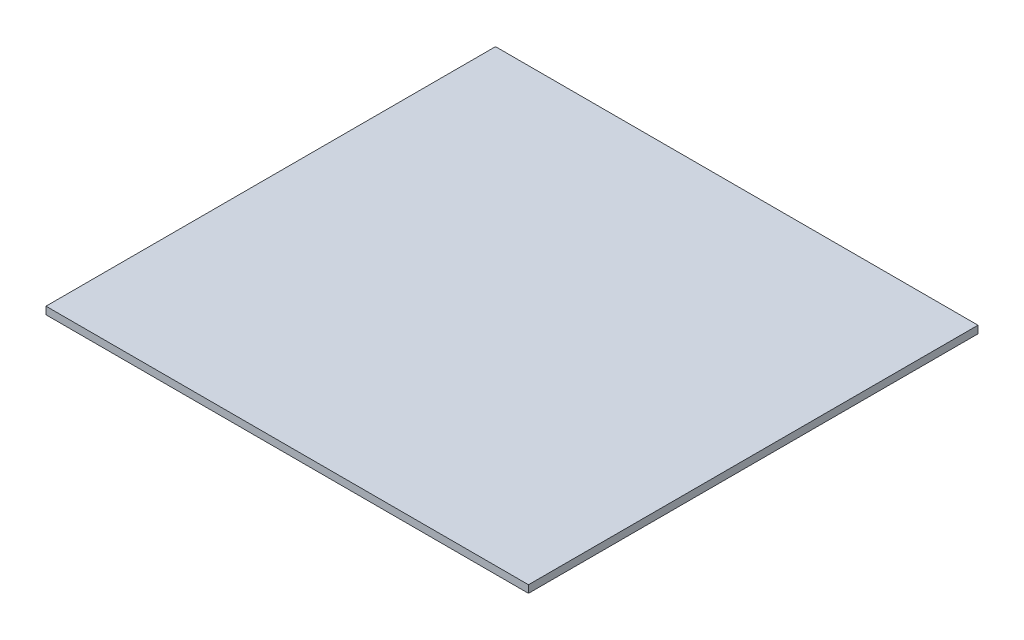
ISO-10303-21;
HEADER;
FILE_DESCRIPTION(('STEP AP214'),'2;1');
FILE_NAME('part.step','',(''),(''),'','','');
FILE_SCHEMA(('AUTOMOTIVE_DESIGN { 1 0 10303 214 1 1 1 1 }'));
ENDSEC;
DATA;
#1=APPLICATION_CONTEXT('core data for automotive mechanical design processes');
#2=APPLICATION_PROTOCOL_DEFINITION('international standard','automotive_design',2000,#1);
#3=PRODUCT_CONTEXT('',#1,'mechanical');
#4=PRODUCT('Part','Part','',(#3));
#5=PRODUCT_RELATED_PRODUCT_CATEGORY('part','',(#4));
#6=PRODUCT_DEFINITION_FORMATION('','',#4);
#7=PRODUCT_DEFINITION_CONTEXT('part definition',#1,'design');
#8=PRODUCT_DEFINITION('design','',#6,#7);
#9=PRODUCT_DEFINITION_SHAPE('','',#8);
#10=(LENGTH_UNIT() NAMED_UNIT(*) SI_UNIT(.MILLI.,.METRE.));
#11=(NAMED_UNIT(*) PLANE_ANGLE_UNIT() SI_UNIT($,.RADIAN.));
#12=(NAMED_UNIT(*) SI_UNIT($,.STERADIAN.) SOLID_ANGLE_UNIT());
#13=UNCERTAINTY_MEASURE_WITH_UNIT(LENGTH_MEASURE(1.E-05),#10,'distance_accuracy_value','');
#14=(GEOMETRIC_REPRESENTATION_CONTEXT(3) GLOBAL_UNCERTAINTY_ASSIGNED_CONTEXT((#13)) GLOBAL_UNIT_ASSIGNED_CONTEXT((#10,
#11,#12)) REPRESENTATION_CONTEXT('',''));
#15=CARTESIAN_POINT('',(0.,0.,0.));
#16=DIRECTION('',(0.,0.,1.));
#17=DIRECTION('',(1.,0.,0.));
#18=AXIS2_PLACEMENT_3D('',#15,#16,#17);
#19=CARTESIAN_POINT('',(0.,5.,0.));
#20=DIRECTION('',(1.,0.,0.));
#21=DIRECTION('',(0.,0.,-1.));
#22=AXIS2_PLACEMENT_3D('',#19,#20,#21);
#23=PLANE('',#22);
#24=DIRECTION('',(0.,0.,1.));
#25=VECTOR('',#24,1.);
#26=CARTESIAN_POINT('',(0.,0.,0.));
#27=LINE('',#26,#25);
#28=CARTESIAN_POINT('',(0.,0.,-300.));
#29=VERTEX_POINT('',#28);
#30=CARTESIAN_POINT('',(0.,0.,0.));
#31=VERTEX_POINT('',#30);
#32=EDGE_CURVE('E107',#29,#31,#27,.T.);
#33=ORIENTED_EDGE('',*,*,#32,.T.);
#34=DIRECTION('',(0.,-1.,0.));
#35=VECTOR('',#34,1.);
#36=CARTESIAN_POINT('',(0.,5.,0.));
#37=LINE('',#36,#35);
#38=CARTESIAN_POINT('',(0.,5.,0.));
#39=VERTEX_POINT('',#38);
#40=EDGE_CURVE('E11',#39,#31,#37,.T.);
#41=ORIENTED_EDGE('',*,*,#40,.F.);
#42=DIRECTION('',(0.,0.,1.));
#43=VECTOR('',#42,1.);
#44=CARTESIAN_POINT('',(0.,5.,0.));
#45=LINE('',#44,#43);
#46=CARTESIAN_POINT('',(0.,5.,-300.));
#47=VERTEX_POINT('',#46);
#48=EDGE_CURVE('E91',#47,#39,#45,.T.);
#49=ORIENTED_EDGE('',*,*,#48,.F.);
#50=DIRECTION('',(0.,-1.,0.));
#51=VECTOR('',#50,1.);
#52=CARTESIAN_POINT('',(0.,5.,-300.));
#53=LINE('',#52,#51);
#54=EDGE_CURVE('E103',#47,#29,#53,.T.);
#55=ORIENTED_EDGE('',*,*,#54,.T.);
#56=EDGE_LOOP('',(#33,#41,#49,#55));
#57=FACE_BOUND('',#56,.T.);
#58=ADVANCED_FACE('F39',(#57),#23,.F.);
#59=CARTESIAN_POINT('',(0.,5.,0.));
#60=DIRECTION('',(0.,0.,-1.));
#61=DIRECTION('',(-1.,0.,0.));
#62=AXIS2_PLACEMENT_3D('',#59,#60,#61);
#63=PLANE('',#62);
#64=DIRECTION('',(1.,0.,0.));
#65=VECTOR('',#64,1.);
#66=CARTESIAN_POINT('',(0.,0.,0.));
#67=LINE('',#66,#65);
#68=CARTESIAN_POINT('',(322.,0.,0.));
#69=VERTEX_POINT('',#68);
#70=EDGE_CURVE('E96',#31,#69,#67,.T.);
#71=ORIENTED_EDGE('',*,*,#70,.T.);
#72=DIRECTION('',(0.,-1.,0.));
#73=VECTOR('',#72,1.);
#74=CARTESIAN_POINT('',(322.,5.,0.));
#75=LINE('',#74,#73);
#76=CARTESIAN_POINT('',(322.,5.,0.));
#77=VERTEX_POINT('',#76);
#78=EDGE_CURVE('E48',#77,#69,#75,.T.);
#79=ORIENTED_EDGE('',*,*,#78,.F.);
#80=DIRECTION('',(1.,0.,0.));
#81=VECTOR('',#80,1.);
#82=CARTESIAN_POINT('',(0.,5.,0.));
#83=LINE('',#82,#81);
#84=EDGE_CURVE('E86',#39,#77,#83,.T.);
#85=ORIENTED_EDGE('',*,*,#84,.F.);
#86=ORIENTED_EDGE('',*,*,#40,.T.);
#87=EDGE_LOOP('',(#71,#79,#85,#86));
#88=FACE_BOUND('',#87,.T.);
#89=ADVANCED_FACE('F95',(#88),#63,.F.);
#90=CARTESIAN_POINT('',(322.,5.,0.));
#91=DIRECTION('',(-1.,0.,0.));
#92=DIRECTION('',(0.,0.,1.));
#93=AXIS2_PLACEMENT_3D('',#90,#91,#92);
#94=PLANE('',#93);
#95=DIRECTION('',(0.,0.,-1.));
#96=VECTOR('',#95,1.);
#97=CARTESIAN_POINT('',(322.,0.,0.));
#98=LINE('',#97,#96);
#99=CARTESIAN_POINT('',(322.,0.,-300.));
#100=VERTEX_POINT('',#99);
#101=EDGE_CURVE('E73',#69,#100,#98,.T.);
#102=ORIENTED_EDGE('',*,*,#101,.T.);
#103=DIRECTION('',(0.,-1.,0.));
#104=VECTOR('',#103,1.);
#105=CARTESIAN_POINT('',(322.,5.,-300.));
#106=LINE('',#105,#104);
#107=CARTESIAN_POINT('',(322.,5.,-300.));
#108=VERTEX_POINT('',#107);
#109=EDGE_CURVE('E98',#108,#100,#106,.T.);
#110=ORIENTED_EDGE('',*,*,#109,.F.);
#111=DIRECTION('',(0.,0.,-1.));
#112=VECTOR('',#111,1.);
#113=CARTESIAN_POINT('',(322.,5.,0.));
#114=LINE('',#113,#112);
#115=EDGE_CURVE('E89',#77,#108,#114,.T.);
#116=ORIENTED_EDGE('',*,*,#115,.F.);
#117=ORIENTED_EDGE('',*,*,#78,.T.);
#118=EDGE_LOOP('',(#102,#110,#116,#117));
#119=FACE_BOUND('',#118,.T.);
#120=ADVANCED_FACE('F99',(#119),#94,.F.);
#121=CARTESIAN_POINT('',(0.,5.,-300.));
#122=DIRECTION('',(0.,0.,1.));
#123=DIRECTION('',(1.,0.,0.));
#124=AXIS2_PLACEMENT_3D('',#121,#122,#123);
#125=PLANE('',#124);
#126=DIRECTION('',(-1.,0.,0.));
#127=VECTOR('',#126,1.);
#128=CARTESIAN_POINT('',(0.,0.,-300.));
#129=LINE('',#128,#127);
#130=EDGE_CURVE('E79',#100,#29,#129,.T.);
#131=ORIENTED_EDGE('',*,*,#130,.T.);
#132=ORIENTED_EDGE('',*,*,#54,.F.);
#133=DIRECTION('',(-1.,0.,0.));
#134=VECTOR('',#133,1.);
#135=CARTESIAN_POINT('',(0.,5.,-300.));
#136=LINE('',#135,#134);
#137=EDGE_CURVE('E56',#108,#47,#136,.T.);
#138=ORIENTED_EDGE('',*,*,#137,.F.);
#139=ORIENTED_EDGE('',*,*,#109,.T.);
#140=EDGE_LOOP('',(#131,#132,#138,#139));
#141=FACE_BOUND('',#140,.T.);
#142=ADVANCED_FACE('F120',(#141),#125,.F.);
#143=CARTESIAN_POINT('',(0.,5.,0.));
#144=DIRECTION('',(0.,-1.,0.));
#145=DIRECTION('',(0.,0.,-1.));
#146=AXIS2_PLACEMENT_3D('',#143,#144,#145);
#147=PLANE('',#146);
#148=ORIENTED_EDGE('',*,*,#48,.T.);
#149=ORIENTED_EDGE('',*,*,#84,.T.);
#150=ORIENTED_EDGE('',*,*,#115,.T.);
#151=ORIENTED_EDGE('',*,*,#137,.T.);
#152=EDGE_LOOP('',(#148,#149,#150,#151));
#153=FACE_BOUND('',#152,.T.);
#154=ADVANCED_FACE('F87',(#153),#147,.F.);
#155=CARTESIAN_POINT('',(0.,0.,0.));
#156=DIRECTION('',(0.,-1.,0.));
#157=DIRECTION('',(0.,0.,-1.));
#158=AXIS2_PLACEMENT_3D('',#155,#156,#157);
#159=PLANE('',#158);
#160=ORIENTED_EDGE('',*,*,#32,.F.);
#161=ORIENTED_EDGE('',*,*,#130,.F.);
#162=ORIENTED_EDGE('',*,*,#101,.F.);
#163=ORIENTED_EDGE('',*,*,#70,.F.);
#164=EDGE_LOOP('',(#160,#161,#162,#163));
#165=FACE_BOUND('',#164,.T.);
#166=ADVANCED_FACE('F123',(#165),#159,.T.);
#167=CLOSED_SHELL('',(#58,#89,#120,#142,#154,#166));
#168=MANIFOLD_SOLID_BREP('B2',#167);
#169=ADVANCED_BREP_SHAPE_REPRESENTATION('',(#18,#168),#14);
#170=SHAPE_DEFINITION_REPRESENTATION(#9,#169);
ENDSEC;
END-ISO-10303-21;
